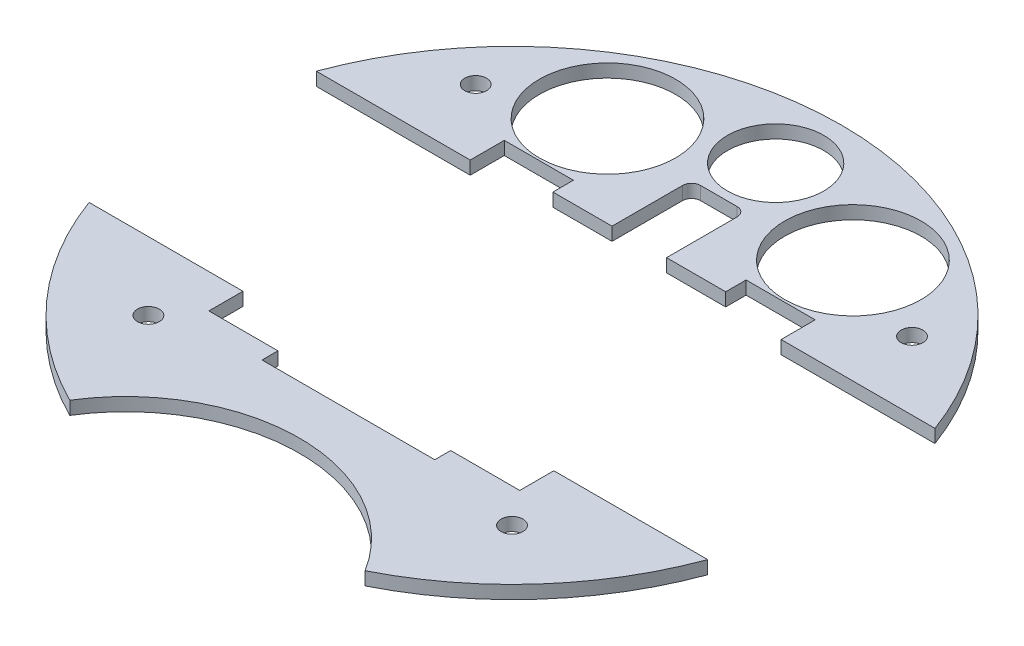
ISO-10303-21;
HEADER;
FILE_DESCRIPTION(('STEP AP214'),'2;1');
FILE_NAME('part.step','',(''),(''),'','','');
FILE_SCHEMA(('AUTOMOTIVE_DESIGN { 1 0 10303 214 1 1 1 1 }'));
ENDSEC;
DATA;
#1=APPLICATION_CONTEXT('core data for automotive mechanical design processes');
#2=APPLICATION_PROTOCOL_DEFINITION('international standard','automotive_design',2000,#1);
#3=PRODUCT_CONTEXT('',#1,'mechanical');
#4=PRODUCT('Part','Part','',(#3));
#5=PRODUCT_RELATED_PRODUCT_CATEGORY('part','',(#4));
#6=PRODUCT_DEFINITION_FORMATION('','',#4);
#7=PRODUCT_DEFINITION_CONTEXT('part definition',#1,'design');
#8=PRODUCT_DEFINITION('design','',#6,#7);
#9=PRODUCT_DEFINITION_SHAPE('','',#8);
#10=(LENGTH_UNIT() NAMED_UNIT(*) SI_UNIT(.MILLI.,.METRE.));
#11=(NAMED_UNIT(*) PLANE_ANGLE_UNIT() SI_UNIT($,.RADIAN.));
#12=(NAMED_UNIT(*) SI_UNIT($,.STERADIAN.) SOLID_ANGLE_UNIT());
#13=UNCERTAINTY_MEASURE_WITH_UNIT(LENGTH_MEASURE(1.E-05),#10,'distance_accuracy_value','');
#14=(GEOMETRIC_REPRESENTATION_CONTEXT(3) GLOBAL_UNCERTAINTY_ASSIGNED_CONTEXT((#13)) GLOBAL_UNIT_ASSIGNED_CONTEXT((#10,
#11,#12)) REPRESENTATION_CONTEXT('',''));
#15=CARTESIAN_POINT('',(0.,0.,0.));
#16=DIRECTION('',(0.,0.,1.));
#17=DIRECTION('',(1.,0.,0.));
#18=AXIS2_PLACEMENT_3D('',#15,#16,#17);
#19=CARTESIAN_POINT('',(0.,2.9,42.5));
#20=DIRECTION('',(0.,1.,0.));
#21=DIRECTION('',(0.,0.,1.));
#22=AXIS2_PLACEMENT_3D('',#19,#20,#21);
#23=PLANE('',#22);
#24=DIRECTION('',(1.,0.,0.));
#25=VECTOR('',#24,1.);
#26=CARTESIAN_POINT('',(34.2,2.9,25.0000000000002));
#27=LINE('',#26,#25);
#28=CARTESIAN_POINT('',(34.2,2.9,25.0000000000002));
#29=VERTEX_POINT('',#28);
#30=CARTESIAN_POINT('',(68.0532879440809,2.9,25.0000000000002));
#31=VERTEX_POINT('',#30);
#32=EDGE_CURVE('E53',#29,#31,#27,.T.);
#33=ORIENTED_EDGE('',*,*,#32,.F.);
#34=DIRECTION('',(0.,0.,-1.));
#35=VECTOR('',#34,1.);
#36=CARTESIAN_POINT('',(34.2,2.9,32.5000000000002));
#37=LINE('',#36,#35);
#38=CARTESIAN_POINT('',(34.2,2.9,32.5000000000002));
#39=VERTEX_POINT('',#38);
#40=EDGE_CURVE('E82',#39,#29,#37,.T.);
#41=ORIENTED_EDGE('',*,*,#40,.F.);
#42=DIRECTION('',(1.,0.,0.));
#43=VECTOR('',#42,1.);
#44=CARTESIAN_POINT('',(34.2,2.9,32.5000000000002));
#45=LINE('',#44,#43);
#46=CARTESIAN_POINT('',(19.,2.9,32.5000000000002));
#47=VERTEX_POINT('',#46);
#48=EDGE_CURVE('E190',#47,#39,#45,.T.);
#49=ORIENTED_EDGE('',*,*,#48,.F.);
#50=DIRECTION('',(0.,0.,-1.));
#51=VECTOR('',#50,1.);
#52=CARTESIAN_POINT('',(19.,2.9,36.));
#53=LINE('',#52,#51);
#54=CARTESIAN_POINT('',(19.,2.9,36.));
#55=VERTEX_POINT('',#54);
#56=EDGE_CURVE('E167',#55,#47,#53,.T.);
#57=ORIENTED_EDGE('',*,*,#56,.F.);
#58=DIRECTION('',(1.,0.,0.));
#59=VECTOR('',#58,1.);
#60=CARTESIAN_POINT('',(-19.,2.9,36.));
#61=LINE('',#60,#59);
#62=CARTESIAN_POINT('',(-19.,2.9,36.));
#63=VERTEX_POINT('',#62);
#64=EDGE_CURVE('E163',#63,#55,#61,.T.);
#65=ORIENTED_EDGE('',*,*,#64,.F.);
#66=DIRECTION('',(0.,0.,1.));
#67=VECTOR('',#66,1.);
#68=CARTESIAN_POINT('',(-19.,2.9,-28.));
#69=LINE('',#68,#67);
#70=CARTESIAN_POINT('',(-19.,2.9,32.5000000000002));
#71=VERTEX_POINT('',#70);
#72=EDGE_CURVE('E154',#71,#63,#69,.T.);
#73=ORIENTED_EDGE('',*,*,#72,.F.);
#74=DIRECTION('',(1.,0.,0.));
#75=VECTOR('',#74,1.);
#76=CARTESIAN_POINT('',(-22.2,2.9,32.5000000000002));
#77=LINE('',#76,#75);
#78=CARTESIAN_POINT('',(-34.2,2.9,32.5000000000002));
#79=VERTEX_POINT('',#78);
#80=EDGE_CURVE('E191',#79,#71,#77,.T.);
#81=ORIENTED_EDGE('',*,*,#80,.F.);
#82=DIRECTION('',(0.,0.,1.));
#83=VECTOR('',#82,1.);
#84=CARTESIAN_POINT('',(-34.2,2.9,32.5000000000002));
#85=LINE('',#84,#83);
#86=CARTESIAN_POINT('',(-34.2,2.9,25.0000000000002));
#87=VERTEX_POINT('',#86);
#88=EDGE_CURVE('E186',#87,#79,#85,.T.);
#89=ORIENTED_EDGE('',*,*,#88,.F.);
#90=DIRECTION('',(1.,0.,0.));
#91=VECTOR('',#90,1.);
#92=CARTESIAN_POINT('',(-34.2,2.9,25.0000000000002));
#93=LINE('',#92,#91);
#94=CARTESIAN_POINT('',(-68.0532879440809,2.9,25.0000000000002));
#95=VERTEX_POINT('',#94);
#96=EDGE_CURVE('E129',#95,#87,#93,.T.);
#97=ORIENTED_EDGE('',*,*,#96,.F.);
#98=CARTESIAN_POINT('',(0.,2.9,0.));
#99=DIRECTION('',(0.,1.,0.));
#100=DIRECTION('',(0.,0.,1.));
#101=AXIS2_PLACEMENT_3D('',#98,#99,#100);
#102=CIRCLE('',#101,72.5);
#103=CARTESIAN_POINT('',(-32.4891087499309,2.9,64.8128676470588));
#104=VERTEX_POINT('',#103);
#105=EDGE_CURVE('E110',#95,#104,#102,.T.);
#106=ORIENTED_EDGE('',*,*,#105,.T.);
#107=CARTESIAN_POINT('',(0.,2.9,85.));
#108=DIRECTION('',(0.,-1.,0.));
#109=DIRECTION('',(0.,0.,1.));
#110=AXIS2_PLACEMENT_3D('',#107,#108,#109);
#111=CIRCLE('',#110,38.25);
#112=CARTESIAN_POINT('',(32.4891087499309,2.9,64.8128676470588));
#113=VERTEX_POINT('',#112);
#114=EDGE_CURVE('E109',#104,#113,#111,.T.);
#115=ORIENTED_EDGE('',*,*,#114,.T.);
#116=EDGE_CURVE('E107',#113,#31,#102,.T.);
#117=ORIENTED_EDGE('',*,*,#116,.T.);
#118=EDGE_LOOP('',(#33,#41,#49,#57,#65,#73,#81,#89,#97,#106,#115,#117));
#119=FACE_BOUND('',#118,.T.);
#120=CARTESIAN_POINT('',(40.,2.9,40.));
#121=DIRECTION('',(0.,1.,0.));
#122=DIRECTION('',(0.,0.,1.));
#123=AXIS2_PLACEMENT_3D('',#120,#121,#122);
#124=CIRCLE('',#123,2.4);
#125=CARTESIAN_POINT('',(40.,2.9,42.4));
#126=VERTEX_POINT('',#125);
#127=EDGE_CURVE('E162',#126,#126,#124,.T.);
#128=ORIENTED_EDGE('',*,*,#127,.F.);
#129=EDGE_LOOP('',(#128));
#130=FACE_BOUND('',#129,.T.);
#131=CARTESIAN_POINT('',(-40.,2.9,40.));
#132=DIRECTION('',(0.,1.,0.));
#133=DIRECTION('',(0.,0.,1.));
#134=AXIS2_PLACEMENT_3D('',#131,#132,#133);
#135=CIRCLE('',#134,2.4);
#136=CARTESIAN_POINT('',(-40.,2.9,42.4));
#137=VERTEX_POINT('',#136);
#138=EDGE_CURVE('E183',#137,#137,#135,.T.);
#139=ORIENTED_EDGE('',*,*,#138,.F.);
#140=EDGE_LOOP('',(#139));
#141=FACE_BOUND('',#140,.T.);
#142=ADVANCED_FACE('F43',(#119,#130,#141),#23,.T.);
#143=CARTESIAN_POINT('',(0.,0.,42.5));
#144=DIRECTION('',(0.,1.,0.));
#145=DIRECTION('',(0.,0.,1.));
#146=AXIS2_PLACEMENT_3D('',#143,#144,#145);
#147=PLANE('',#146);
#148=CARTESIAN_POINT('',(40.,0.,40.));
#149=DIRECTION('',(0.,1.,0.));
#150=DIRECTION('',(0.,0.,1.));
#151=AXIS2_PLACEMENT_3D('',#148,#149,#150);
#152=CIRCLE('',#151,2.4);
#153=CARTESIAN_POINT('',(40.,0.,42.4));
#154=VERTEX_POINT('',#153);
#155=EDGE_CURVE('E101',#154,#154,#152,.T.);
#156=ORIENTED_EDGE('',*,*,#155,.T.);
#157=EDGE_LOOP('',(#156));
#158=FACE_BOUND('',#157,.T.);
#159=CARTESIAN_POINT('',(-40.,0.,40.));
#160=DIRECTION('',(0.,1.,0.));
#161=DIRECTION('',(0.,0.,1.));
#162=AXIS2_PLACEMENT_3D('',#159,#160,#161);
#163=CIRCLE('',#162,2.4);
#164=CARTESIAN_POINT('',(-40.,0.,42.4));
#165=VERTEX_POINT('',#164);
#166=EDGE_CURVE('E98',#165,#165,#163,.T.);
#167=ORIENTED_EDGE('',*,*,#166,.T.);
#168=EDGE_LOOP('',(#167));
#169=FACE_BOUND('',#168,.T.);
#170=DIRECTION('',(0.,0.,-1.));
#171=VECTOR('',#170,1.);
#172=CARTESIAN_POINT('',(34.2,0.,32.5000000000002));
#173=LINE('',#172,#171);
#174=CARTESIAN_POINT('',(34.2,0.,32.5000000000002));
#175=VERTEX_POINT('',#174);
#176=CARTESIAN_POINT('',(34.2,0.,25.0000000000002));
#177=VERTEX_POINT('',#176);
#178=EDGE_CURVE('E79',#175,#177,#173,.T.);
#179=ORIENTED_EDGE('',*,*,#178,.T.);
#180=DIRECTION('',(1.,0.,0.));
#181=VECTOR('',#180,1.);
#182=CARTESIAN_POINT('',(34.2,0.,25.0000000000002));
#183=LINE('',#182,#181);
#184=CARTESIAN_POINT('',(68.0532879440809,0.,25.0000000000002));
#185=VERTEX_POINT('',#184);
#186=EDGE_CURVE('E85',#177,#185,#183,.T.);
#187=ORIENTED_EDGE('',*,*,#186,.T.);
#188=CARTESIAN_POINT('',(0.,0.,0.));
#189=DIRECTION('',(0.,1.,0.));
#190=DIRECTION('',(0.,0.,1.));
#191=AXIS2_PLACEMENT_3D('',#188,#189,#190);
#192=CIRCLE('',#191,72.5);
#193=CARTESIAN_POINT('',(32.4891087499309,0.,64.8128676470588));
#194=VERTEX_POINT('',#193);
#195=EDGE_CURVE('E47',#194,#185,#192,.T.);
#196=ORIENTED_EDGE('',*,*,#195,.F.);
#197=CARTESIAN_POINT('',(0.,0.,85.));
#198=DIRECTION('',(0.,-1.,0.));
#199=DIRECTION('',(0.,0.,1.));
#200=AXIS2_PLACEMENT_3D('',#197,#198,#199);
#201=CIRCLE('',#200,38.25);
#202=CARTESIAN_POINT('',(-32.4891087499309,0.,64.8128676470588));
#203=VERTEX_POINT('',#202);
#204=EDGE_CURVE('E143',#203,#194,#201,.T.);
#205=ORIENTED_EDGE('',*,*,#204,.F.);
#206=CARTESIAN_POINT('',(-68.0532879440809,0.,25.0000000000002));
#207=VERTEX_POINT('',#206);
#208=EDGE_CURVE('E105',#207,#203,#192,.T.);
#209=ORIENTED_EDGE('',*,*,#208,.F.);
#210=DIRECTION('',(1.,0.,0.));
#211=VECTOR('',#210,1.);
#212=CARTESIAN_POINT('',(-34.2,0.,25.0000000000002));
#213=LINE('',#212,#211);
#214=CARTESIAN_POINT('',(-34.2,0.,25.0000000000002));
#215=VERTEX_POINT('',#214);
#216=EDGE_CURVE('E92',#207,#215,#213,.T.);
#217=ORIENTED_EDGE('',*,*,#216,.T.);
#218=DIRECTION('',(0.,0.,1.));
#219=VECTOR('',#218,1.);
#220=CARTESIAN_POINT('',(-34.2,0.,32.5000000000002));
#221=LINE('',#220,#219);
#222=CARTESIAN_POINT('',(-34.2,0.,32.5000000000002));
#223=VERTEX_POINT('',#222);
#224=EDGE_CURVE('E206',#215,#223,#221,.T.);
#225=ORIENTED_EDGE('',*,*,#224,.T.);
#226=DIRECTION('',(1.,0.,0.));
#227=VECTOR('',#226,1.);
#228=CARTESIAN_POINT('',(-34.2,0.,32.5000000000002));
#229=LINE('',#228,#227);
#230=CARTESIAN_POINT('',(-19.,0.,32.5000000000002));
#231=VERTEX_POINT('',#230);
#232=EDGE_CURVE('E181',#223,#231,#229,.T.);
#233=ORIENTED_EDGE('',*,*,#232,.T.);
#234=DIRECTION('',(0.,0.,1.));
#235=VECTOR('',#234,1.);
#236=CARTESIAN_POINT('',(-19.,0.,-28.));
#237=LINE('',#236,#235);
#238=CARTESIAN_POINT('',(-19.,0.,36.));
#239=VERTEX_POINT('',#238);
#240=EDGE_CURVE('E178',#231,#239,#237,.T.);
#241=ORIENTED_EDGE('',*,*,#240,.T.);
#242=DIRECTION('',(1.,0.,0.));
#243=VECTOR('',#242,1.);
#244=CARTESIAN_POINT('',(-19.,0.,36.));
#245=LINE('',#244,#243);
#246=CARTESIAN_POINT('',(19.,0.,36.));
#247=VERTEX_POINT('',#246);
#248=EDGE_CURVE('E175',#239,#247,#245,.T.);
#249=ORIENTED_EDGE('',*,*,#248,.T.);
#250=DIRECTION('',(0.,0.,-1.));
#251=VECTOR('',#250,1.);
#252=CARTESIAN_POINT('',(19.,0.,36.));
#253=LINE('',#252,#251);
#254=CARTESIAN_POINT('',(19.,0.,32.5000000000002));
#255=VERTEX_POINT('',#254);
#256=EDGE_CURVE('E106',#247,#255,#253,.T.);
#257=ORIENTED_EDGE('',*,*,#256,.T.);
#258=DIRECTION('',(1.,0.,0.));
#259=VECTOR('',#258,1.);
#260=CARTESIAN_POINT('',(22.2,0.,32.5000000000002));
#261=LINE('',#260,#259);
#262=EDGE_CURVE('E97',#255,#175,#261,.T.);
#263=ORIENTED_EDGE('',*,*,#262,.T.);
#264=EDGE_LOOP('',(#179,#187,#196,#205,#209,#217,#225,#233,#241,#249,#257,#263));
#265=FACE_BOUND('',#264,.T.);
#266=ADVANCED_FACE('F94',(#158,#169,#265),#147,.F.);
#267=CARTESIAN_POINT('',(0.,2.9,0.));
#268=DIRECTION('',(0.,-1.,0.));
#269=DIRECTION('',(0.,0.,-1.));
#270=AXIS2_PLACEMENT_3D('',#267,#268,#269);
#271=CYLINDRICAL_SURFACE('',#270,72.5);
#272=ORIENTED_EDGE('',*,*,#105,.F.);
#273=DIRECTION('',(0.,1.,0.));
#274=VECTOR('',#273,1.);
#275=CARTESIAN_POINT('',(-68.0532879440809,0.,25.0000000000002));
#276=LINE('',#275,#274);
#277=EDGE_CURVE('E193',#207,#95,#276,.T.);
#278=ORIENTED_EDGE('',*,*,#277,.F.);
#279=ORIENTED_EDGE('',*,*,#208,.T.);
#280=DIRECTION('',(0.,-1.,0.));
#281=VECTOR('',#280,1.);
#282=CARTESIAN_POINT('',(-32.4891087499309,2.9,64.8128676470588));
#283=LINE('',#282,#281);
#284=EDGE_CURVE('E136',#104,#203,#283,.T.);
#285=ORIENTED_EDGE('',*,*,#284,.F.);
#286=EDGE_LOOP('',(#272,#278,#279,#285));
#287=FACE_BOUND('',#286,.T.);
#288=ADVANCED_FACE('F137',(#287),#271,.T.);
#289=CARTESIAN_POINT('',(0.,2.9,85.));
#290=DIRECTION('',(0.,-1.,0.));
#291=DIRECTION('',(0.,0.,-1.));
#292=AXIS2_PLACEMENT_3D('',#289,#290,#291);
#293=CYLINDRICAL_SURFACE('',#292,38.25);
#294=ORIENTED_EDGE('',*,*,#204,.T.);
#295=DIRECTION('',(0.,-1.,0.));
#296=VECTOR('',#295,1.);
#297=CARTESIAN_POINT('',(32.4891087499309,2.9,64.8128676470588));
#298=LINE('',#297,#296);
#299=EDGE_CURVE('E147',#113,#194,#298,.T.);
#300=ORIENTED_EDGE('',*,*,#299,.F.);
#301=ORIENTED_EDGE('',*,*,#114,.F.);
#302=ORIENTED_EDGE('',*,*,#284,.T.);
#303=EDGE_LOOP('',(#294,#300,#301,#302));
#304=FACE_BOUND('',#303,.T.);
#305=ADVANCED_FACE('F145',(#304),#293,.F.);
#306=ORIENTED_EDGE('',*,*,#195,.T.);
#307=DIRECTION('',(0.,1.,0.));
#308=VECTOR('',#307,1.);
#309=CARTESIAN_POINT('',(68.0532879440809,0.,25.0000000000002));
#310=LINE('',#309,#308);
#311=EDGE_CURVE('E88',#185,#31,#310,.T.);
#312=ORIENTED_EDGE('',*,*,#311,.T.);
#313=ORIENTED_EDGE('',*,*,#116,.F.);
#314=ORIENTED_EDGE('',*,*,#299,.T.);
#315=EDGE_LOOP('',(#306,#312,#313,#314));
#316=FACE_BOUND('',#315,.T.);
#317=ADVANCED_FACE('F45',(#316),#271,.T.);
#318=CARTESIAN_POINT('',(-19.,0.,-28.));
#319=DIRECTION('',(-1.,0.,0.));
#320=DIRECTION('',(0.,0.,1.));
#321=AXIS2_PLACEMENT_3D('',#318,#319,#320);
#322=PLANE('',#321);
#323=ORIENTED_EDGE('',*,*,#240,.F.);
#324=DIRECTION('',(0.,1.,0.));
#325=VECTOR('',#324,1.);
#326=CARTESIAN_POINT('',(-19.,0.,32.5000000000002));
#327=LINE('',#326,#325);
#328=EDGE_CURVE('E151',#231,#71,#327,.T.);
#329=ORIENTED_EDGE('',*,*,#328,.T.);
#330=ORIENTED_EDGE('',*,*,#72,.T.);
#331=DIRECTION('',(0.,1.,0.));
#332=VECTOR('',#331,1.);
#333=CARTESIAN_POINT('',(-19.,0.,36.));
#334=LINE('',#333,#332);
#335=EDGE_CURVE('E159',#239,#63,#334,.T.);
#336=ORIENTED_EDGE('',*,*,#335,.F.);
#337=EDGE_LOOP('',(#323,#329,#330,#336));
#338=FACE_BOUND('',#337,.T.);
#339=ADVANCED_FACE('F262',(#338),#322,.F.);
#340=CARTESIAN_POINT('',(19.,0.,36.));
#341=DIRECTION('',(1.,0.,0.));
#342=DIRECTION('',(0.,0.,-1.));
#343=AXIS2_PLACEMENT_3D('',#340,#341,#342);
#344=PLANE('',#343);
#345=ORIENTED_EDGE('',*,*,#56,.T.);
#346=DIRECTION('',(0.,1.,0.));
#347=VECTOR('',#346,1.);
#348=CARTESIAN_POINT('',(19.,0.,32.5000000000002));
#349=LINE('',#348,#347);
#350=EDGE_CURVE('E211',#255,#47,#349,.T.);
#351=ORIENTED_EDGE('',*,*,#350,.F.);
#352=ORIENTED_EDGE('',*,*,#256,.F.);
#353=DIRECTION('',(0.,1.,0.));
#354=VECTOR('',#353,1.);
#355=CARTESIAN_POINT('',(19.,0.,36.));
#356=LINE('',#355,#354);
#357=EDGE_CURVE('E164',#247,#55,#356,.T.);
#358=ORIENTED_EDGE('',*,*,#357,.T.);
#359=EDGE_LOOP('',(#345,#351,#352,#358));
#360=FACE_BOUND('',#359,.T.);
#361=ADVANCED_FACE('F270',(#360),#344,.F.);
#362=CARTESIAN_POINT('',(-19.,0.,36.));
#363=DIRECTION('',(0.,0.,1.));
#364=DIRECTION('',(1.,0.,0.));
#365=AXIS2_PLACEMENT_3D('',#362,#363,#364);
#366=PLANE('',#365);
#367=ORIENTED_EDGE('',*,*,#64,.T.);
#368=ORIENTED_EDGE('',*,*,#357,.F.);
#369=ORIENTED_EDGE('',*,*,#248,.F.);
#370=ORIENTED_EDGE('',*,*,#335,.T.);
#371=EDGE_LOOP('',(#367,#368,#369,#370));
#372=FACE_BOUND('',#371,.T.);
#373=ADVANCED_FACE('F268',(#372),#366,.F.);
#374=CARTESIAN_POINT('',(40.,0.,40.));
#375=DIRECTION('',(0.,1.,0.));
#376=DIRECTION('',(0.,0.,1.));
#377=AXIS2_PLACEMENT_3D('',#374,#375,#376);
#378=CYLINDRICAL_SURFACE('',#377,2.4);
#379=ORIENTED_EDGE('',*,*,#155,.F.);
#380=EDGE_LOOP('',(#379));
#381=FACE_BOUND('',#380,.T.);
#382=ORIENTED_EDGE('',*,*,#127,.T.);
#383=EDGE_LOOP('',(#382));
#384=FACE_BOUND('',#383,.T.);
#385=ADVANCED_FACE('F279',(#381,#384),#378,.F.);
#386=CARTESIAN_POINT('',(-40.,0.,40.));
#387=DIRECTION('',(0.,1.,0.));
#388=DIRECTION('',(0.,0.,1.));
#389=AXIS2_PLACEMENT_3D('',#386,#387,#388);
#390=CYLINDRICAL_SURFACE('',#389,2.4);
#391=ORIENTED_EDGE('',*,*,#166,.F.);
#392=EDGE_LOOP('',(#391));
#393=FACE_BOUND('',#392,.T.);
#394=ORIENTED_EDGE('',*,*,#138,.T.);
#395=EDGE_LOOP('',(#394));
#396=FACE_BOUND('',#395,.T.);
#397=ADVANCED_FACE('F302',(#393,#396),#390,.F.);
#398=CARTESIAN_POINT('',(-34.2,0.,32.5000000000002));
#399=DIRECTION('',(-1.,0.,0.));
#400=DIRECTION('',(0.,0.,1.));
#401=AXIS2_PLACEMENT_3D('',#398,#399,#400);
#402=PLANE('',#401);
#403=ORIENTED_EDGE('',*,*,#88,.T.);
#404=DIRECTION('',(0.,1.,0.));
#405=VECTOR('',#404,1.);
#406=CARTESIAN_POINT('',(-34.2,0.,32.5000000000002));
#407=LINE('',#406,#405);
#408=EDGE_CURVE('E188',#223,#79,#407,.T.);
#409=ORIENTED_EDGE('',*,*,#408,.F.);
#410=ORIENTED_EDGE('',*,*,#224,.F.);
#411=DIRECTION('',(0.,1.,0.));
#412=VECTOR('',#411,1.);
#413=CARTESIAN_POINT('',(-34.2,0.,25.0000000000002));
#414=LINE('',#413,#412);
#415=EDGE_CURVE('E196',#215,#87,#414,.T.);
#416=ORIENTED_EDGE('',*,*,#415,.T.);
#417=EDGE_LOOP('',(#403,#409,#410,#416));
#418=FACE_BOUND('',#417,.T.);
#419=ADVANCED_FACE('F251',(#418),#402,.F.);
#420=CARTESIAN_POINT('',(-34.2,0.,25.0000000000002));
#421=DIRECTION('',(0.,0.,1.));
#422=DIRECTION('',(1.,0.,0.));
#423=AXIS2_PLACEMENT_3D('',#420,#421,#422);
#424=PLANE('',#423);
#425=ORIENTED_EDGE('',*,*,#96,.T.);
#426=ORIENTED_EDGE('',*,*,#415,.F.);
#427=ORIENTED_EDGE('',*,*,#216,.F.);
#428=ORIENTED_EDGE('',*,*,#277,.T.);
#429=EDGE_LOOP('',(#425,#426,#427,#428));
#430=FACE_BOUND('',#429,.T.);
#431=ADVANCED_FACE('F257',(#430),#424,.F.);
#432=CARTESIAN_POINT('',(-22.2,0.,32.5000000000002));
#433=DIRECTION('',(0.,0.,1.));
#434=DIRECTION('',(1.,0.,0.));
#435=AXIS2_PLACEMENT_3D('',#432,#433,#434);
#436=PLANE('',#435);
#437=ORIENTED_EDGE('',*,*,#80,.T.);
#438=ORIENTED_EDGE('',*,*,#328,.F.);
#439=ORIENTED_EDGE('',*,*,#232,.F.);
#440=ORIENTED_EDGE('',*,*,#408,.T.);
#441=EDGE_LOOP('',(#437,#438,#439,#440));
#442=FACE_BOUND('',#441,.T.);
#443=ADVANCED_FACE('F254',(#442),#436,.F.);
#444=CARTESIAN_POINT('',(34.2,0.,32.5000000000002));
#445=DIRECTION('',(0.,0.,1.));
#446=DIRECTION('',(1.,0.,0.));
#447=AXIS2_PLACEMENT_3D('',#444,#445,#446);
#448=PLANE('',#447);
#449=ORIENTED_EDGE('',*,*,#48,.T.);
#450=DIRECTION('',(0.,1.,0.));
#451=VECTOR('',#450,1.);
#452=CARTESIAN_POINT('',(34.2,0.,32.5000000000002));
#453=LINE('',#452,#451);
#454=EDGE_CURVE('E213',#175,#39,#453,.T.);
#455=ORIENTED_EDGE('',*,*,#454,.F.);
#456=ORIENTED_EDGE('',*,*,#262,.F.);
#457=ORIENTED_EDGE('',*,*,#350,.T.);
#458=EDGE_LOOP('',(#449,#455,#456,#457));
#459=FACE_BOUND('',#458,.T.);
#460=ADVANCED_FACE('F220',(#459),#448,.F.);
#461=CARTESIAN_POINT('',(34.2,0.,32.5000000000002));
#462=DIRECTION('',(1.,0.,0.));
#463=DIRECTION('',(0.,0.,-1.));
#464=AXIS2_PLACEMENT_3D('',#461,#462,#463);
#465=PLANE('',#464);
#466=ORIENTED_EDGE('',*,*,#40,.T.);
#467=DIRECTION('',(0.,1.,0.));
#468=VECTOR('',#467,1.);
#469=CARTESIAN_POINT('',(34.2,0.,25.0000000000002));
#470=LINE('',#469,#468);
#471=EDGE_CURVE('E12',#177,#29,#470,.T.);
#472=ORIENTED_EDGE('',*,*,#471,.F.);
#473=ORIENTED_EDGE('',*,*,#178,.F.);
#474=ORIENTED_EDGE('',*,*,#454,.T.);
#475=EDGE_LOOP('',(#466,#472,#473,#474));
#476=FACE_BOUND('',#475,.T.);
#477=ADVANCED_FACE('F77',(#476),#465,.F.);
#478=CARTESIAN_POINT('',(34.2,0.,25.0000000000002));
#479=DIRECTION('',(0.,0.,1.));
#480=DIRECTION('',(1.,0.,0.));
#481=AXIS2_PLACEMENT_3D('',#478,#479,#480);
#482=PLANE('',#481);
#483=ORIENTED_EDGE('',*,*,#32,.T.);
#484=ORIENTED_EDGE('',*,*,#311,.F.);
#485=ORIENTED_EDGE('',*,*,#186,.F.);
#486=ORIENTED_EDGE('',*,*,#471,.T.);
#487=EDGE_LOOP('',(#483,#484,#485,#486));
#488=FACE_BOUND('',#487,.T.);
#489=ADVANCED_FACE('F86',(#488),#482,.F.);
#490=CLOSED_SHELL('',(#142,#266,#288,#305,#317,#339,#361,#373,#385,#397,#419,#431,#443,#460,
#477,#489));
#491=MANIFOLD_SOLID_BREP('B2',#490);
#492=CARTESIAN_POINT('',(19.,0.,-28.));
#493=DIRECTION('',(0.,0.,-1.));
#494=DIRECTION('',(-1.,0.,0.));
#495=AXIS2_PLACEMENT_3D('',#492,#493,#494);
#496=PLANE('',#495);
#497=DIRECTION('',(-1.,0.,0.));
#498=VECTOR('',#497,1.);
#499=CARTESIAN_POINT('',(19.,0.,-28.));
#500=LINE('',#499,#498);
#501=CARTESIAN_POINT('',(-6.,0.,-28.));
#502=VERTEX_POINT('',#501);
#503=CARTESIAN_POINT('',(-19.,0.,-28.));
#504=VERTEX_POINT('',#503);
#505=EDGE_CURVE('E444',#502,#504,#500,.T.);
#506=ORIENTED_EDGE('',*,*,#505,.F.);
#507=DIRECTION('',(0.,1.,0.));
#508=VECTOR('',#507,1.);
#509=CARTESIAN_POINT('',(-6.,0.,-28.));
#510=LINE('',#509,#508);
#511=CARTESIAN_POINT('',(-6.,2.9,-28.));
#512=VERTEX_POINT('',#511);
#513=EDGE_CURVE('E883',#502,#512,#510,.T.);
#514=ORIENTED_EDGE('',*,*,#513,.T.);
#515=DIRECTION('',(-1.,0.,0.));
#516=VECTOR('',#515,1.);
#517=CARTESIAN_POINT('',(19.,2.9,-28.));
#518=LINE('',#517,#516);
#519=CARTESIAN_POINT('',(-19.,2.9,-28.));
#520=VERTEX_POINT('',#519);
#521=EDGE_CURVE('E568',#512,#520,#518,.T.);
#522=ORIENTED_EDGE('',*,*,#521,.T.);
#523=DIRECTION('',(0.,1.,0.));
#524=VECTOR('',#523,1.);
#525=CARTESIAN_POINT('',(-19.,0.,-28.));
#526=LINE('',#525,#524);
#527=EDGE_CURVE('E561',#504,#520,#526,.T.);
#528=ORIENTED_EDGE('',*,*,#527,.F.);
#529=EDGE_LOOP('',(#506,#514,#522,#528));
#530=FACE_BOUND('',#529,.T.);
#531=ADVANCED_FACE('F420',(#530),#496,.F.);
#532=CARTESIAN_POINT('',(27.,0.,-48.));
#533=DIRECTION('',(0.,1.,0.));
#534=DIRECTION('',(0.,0.,1.));
#535=AXIS2_PLACEMENT_3D('',#532,#533,#534);
#536=CYLINDRICAL_SURFACE('',#535,15.);
#537=CARTESIAN_POINT('',(27.,0.,-48.));
#538=DIRECTION('',(0.,1.,0.));
#539=DIRECTION('',(0.,0.,1.));
#540=AXIS2_PLACEMENT_3D('',#537,#538,#539);
#541=CIRCLE('',#540,15.);
#542=CARTESIAN_POINT('',(27.,0.,-33.));
#543=VERTEX_POINT('',#542);
#544=EDGE_CURVE('E635',#543,#543,#541,.T.);
#545=ORIENTED_EDGE('',*,*,#544,.F.);
#546=EDGE_LOOP('',(#545));
#547=FACE_BOUND('',#546,.T.);
#548=CARTESIAN_POINT('',(27.,2.9,-48.));
#549=DIRECTION('',(0.,1.,0.));
#550=DIRECTION('',(0.,0.,1.));
#551=AXIS2_PLACEMENT_3D('',#548,#549,#550);
#552=CIRCLE('',#551,15.);
#553=CARTESIAN_POINT('',(27.,2.9,-33.));
#554=VERTEX_POINT('',#553);
#555=EDGE_CURVE('E565',#554,#554,#552,.T.);
#556=ORIENTED_EDGE('',*,*,#555,.T.);
#557=EDGE_LOOP('',(#556));
#558=FACE_BOUND('',#557,.T.);
#559=ADVANCED_FACE('F642',(#547,#558),#536,.F.);
#560=CARTESIAN_POINT('',(-27.,0.,-48.));
#561=DIRECTION('',(0.,1.,0.));
#562=DIRECTION('',(0.,0.,1.));
#563=AXIS2_PLACEMENT_3D('',#560,#561,#562);
#564=CYLINDRICAL_SURFACE('',#563,15.);
#565=CARTESIAN_POINT('',(-27.,0.,-48.));
#566=DIRECTION('',(0.,1.,0.));
#567=DIRECTION('',(0.,0.,1.));
#568=AXIS2_PLACEMENT_3D('',#565,#566,#567);
#569=CIRCLE('',#568,15.);
#570=CARTESIAN_POINT('',(-27.,0.,-33.));
#571=VERTEX_POINT('',#570);
#572=EDGE_CURVE('E631',#571,#571,#569,.T.);
#573=ORIENTED_EDGE('',*,*,#572,.F.);
#574=EDGE_LOOP('',(#573));
#575=FACE_BOUND('',#574,.T.);
#576=CARTESIAN_POINT('',(-27.,2.9,-48.));
#577=DIRECTION('',(0.,1.,0.));
#578=DIRECTION('',(0.,0.,1.));
#579=AXIS2_PLACEMENT_3D('',#576,#577,#578);
#580=CIRCLE('',#579,15.);
#581=CARTESIAN_POINT('',(-27.,2.9,-33.));
#582=VERTEX_POINT('',#581);
#583=EDGE_CURVE('E622',#582,#582,#580,.T.);
#584=ORIENTED_EDGE('',*,*,#583,.T.);
#585=EDGE_LOOP('',(#584));
#586=FACE_BOUND('',#585,.T.);
#587=ADVANCED_FACE('F662',(#575,#586),#564,.F.);
#588=CARTESIAN_POINT('',(-48.,0.,-40.));
#589=DIRECTION('',(0.,1.,0.));
#590=DIRECTION('',(0.,0.,1.));
#591=AXIS2_PLACEMENT_3D('',#588,#589,#590);
#592=CYLINDRICAL_SURFACE('',#591,2.4);
#593=CARTESIAN_POINT('',(-48.,0.,-40.));
#594=DIRECTION('',(0.,1.,0.));
#595=DIRECTION('',(0.,0.,1.));
#596=AXIS2_PLACEMENT_3D('',#593,#594,#595);
#597=CIRCLE('',#596,2.4);
#598=CARTESIAN_POINT('',(-48.,0.,-37.6));
#599=VERTEX_POINT('',#598);
#600=EDGE_CURVE('E626',#599,#599,#597,.T.);
#601=ORIENTED_EDGE('',*,*,#600,.F.);
#602=EDGE_LOOP('',(#601));
#603=FACE_BOUND('',#602,.T.);
#604=CARTESIAN_POINT('',(-48.,2.9,-40.));
#605=DIRECTION('',(0.,1.,0.));
#606=DIRECTION('',(0.,0.,1.));
#607=AXIS2_PLACEMENT_3D('',#604,#605,#606);
#608=CIRCLE('',#607,2.4);
#609=CARTESIAN_POINT('',(-48.,2.9,-37.6));
#610=VERTEX_POINT('',#609);
#611=EDGE_CURVE('E591',#610,#610,#608,.T.);
#612=ORIENTED_EDGE('',*,*,#611,.T.);
#613=EDGE_LOOP('',(#612));
#614=FACE_BOUND('',#613,.T.);
#615=ADVANCED_FACE('F683',(#603,#614),#592,.F.);
#616=CARTESIAN_POINT('',(48.,0.,-40.));
#617=DIRECTION('',(0.,1.,0.));
#618=DIRECTION('',(0.,0.,1.));
#619=AXIS2_PLACEMENT_3D('',#616,#617,#618);
#620=CYLINDRICAL_SURFACE('',#619,2.4);
#621=CARTESIAN_POINT('',(48.,0.,-40.));
#622=DIRECTION('',(0.,1.,0.));
#623=DIRECTION('',(0.,0.,1.));
#624=AXIS2_PLACEMENT_3D('',#621,#622,#623);
#625=CIRCLE('',#624,2.4);
#626=CARTESIAN_POINT('',(48.,0.,-37.6));
#627=VERTEX_POINT('',#626);
#628=EDGE_CURVE('E619',#627,#627,#625,.T.);
#629=ORIENTED_EDGE('',*,*,#628,.F.);
#630=EDGE_LOOP('',(#629));
#631=FACE_BOUND('',#630,.T.);
#632=CARTESIAN_POINT('',(48.,2.9,-40.));
#633=DIRECTION('',(0.,1.,0.));
#634=DIRECTION('',(0.,0.,1.));
#635=AXIS2_PLACEMENT_3D('',#632,#633,#634);
#636=CIRCLE('',#635,2.4);
#637=CARTESIAN_POINT('',(48.,2.9,-37.6));
#638=VERTEX_POINT('',#637);
#639=EDGE_CURVE('E623',#638,#638,#636,.T.);
#640=ORIENTED_EDGE('',*,*,#639,.T.);
#641=EDGE_LOOP('',(#640));
#642=FACE_BOUND('',#641,.T.);
#643=ADVANCED_FACE('F680',(#631,#642),#620,.F.);
#644=CARTESIAN_POINT('',(-34.2,0.,-24.9999999999998));
#645=DIRECTION('',(0.,0.,-1.));
#646=DIRECTION('',(-1.,0.,0.));
#647=AXIS2_PLACEMENT_3D('',#644,#645,#646);
#648=PLANE('',#647);
#649=DIRECTION('',(-1.,0.,0.));
#650=VECTOR('',#649,1.);
#651=CARTESIAN_POINT('',(-34.2,2.9,-24.9999999999998));
#652=LINE('',#651,#650);
#653=CARTESIAN_POINT('',(-34.2,2.9,-24.9999999999998));
#654=VERTEX_POINT('',#653);
#655=CARTESIAN_POINT('',(-68.053287944081,2.9,-24.9999999999998));
#656=VERTEX_POINT('',#655);
#657=EDGE_CURVE('E590',#654,#656,#652,.T.);
#658=ORIENTED_EDGE('',*,*,#657,.T.);
#659=DIRECTION('',(0.,1.,0.));
#660=VECTOR('',#659,1.);
#661=CARTESIAN_POINT('',(-68.053287944081,0.,-24.9999999999998));
#662=LINE('',#661,#660);
#663=CARTESIAN_POINT('',(-68.053287944081,0.,-24.9999999999998));
#664=VERTEX_POINT('',#663);
#665=EDGE_CURVE('E579',#664,#656,#662,.T.);
#666=ORIENTED_EDGE('',*,*,#665,.F.);
#667=DIRECTION('',(-1.,0.,0.));
#668=VECTOR('',#667,1.);
#669=CARTESIAN_POINT('',(-34.2,0.,-24.9999999999998));
#670=LINE('',#669,#668);
#671=CARTESIAN_POINT('',(-34.2,0.,-24.9999999999998));
#672=VERTEX_POINT('',#671);
#673=EDGE_CURVE('E587',#672,#664,#670,.T.);
#674=ORIENTED_EDGE('',*,*,#673,.F.);
#675=DIRECTION('',(0.,1.,0.));
#676=VECTOR('',#675,1.);
#677=CARTESIAN_POINT('',(-34.2,0.,-24.9999999999998));
#678=LINE('',#677,#676);
#679=EDGE_CURVE('E592',#672,#654,#678,.T.);
#680=ORIENTED_EDGE('',*,*,#679,.T.);
#681=EDGE_LOOP('',(#658,#666,#674,#680));
#682=FACE_BOUND('',#681,.T.);
#683=ADVANCED_FACE('F586',(#682),#648,.F.);
#684=CARTESIAN_POINT('',(-34.2,0.,-24.9999999999998));
#685=DIRECTION('',(-1.,0.,0.));
#686=DIRECTION('',(0.,0.,1.));
#687=AXIS2_PLACEMENT_3D('',#684,#685,#686);
#688=PLANE('',#687);
#689=DIRECTION('',(0.,0.,1.));
#690=VECTOR('',#689,1.);
#691=CARTESIAN_POINT('',(-34.2,2.9,-24.9999999999998));
#692=LINE('',#691,#690);
#693=CARTESIAN_POINT('',(-34.2,2.9,-32.4999999999999));
#694=VERTEX_POINT('',#693);
#695=EDGE_CURVE('E612',#694,#654,#692,.T.);
#696=ORIENTED_EDGE('',*,*,#695,.T.);
#697=ORIENTED_EDGE('',*,*,#679,.F.);
#698=DIRECTION('',(0.,0.,1.));
#699=VECTOR('',#698,1.);
#700=CARTESIAN_POINT('',(-34.2,0.,-24.9999999999998));
#701=LINE('',#700,#699);
#702=CARTESIAN_POINT('',(-34.2,0.,-32.4999999999999));
#703=VERTEX_POINT('',#702);
#704=EDGE_CURVE('E596',#703,#672,#701,.T.);
#705=ORIENTED_EDGE('',*,*,#704,.F.);
#706=DIRECTION('',(0.,1.,0.));
#707=VECTOR('',#706,1.);
#708=CARTESIAN_POINT('',(-34.2,0.,-32.4999999999999));
#709=LINE('',#708,#707);
#710=EDGE_CURVE('E600',#703,#694,#709,.T.);
#711=ORIENTED_EDGE('',*,*,#710,.T.);
#712=EDGE_LOOP('',(#696,#697,#705,#711));
#713=FACE_BOUND('',#712,.T.);
#714=ADVANCED_FACE('F675',(#713),#688,.F.);
#715=CARTESIAN_POINT('',(-34.2,0.,-32.4999999999999));
#716=DIRECTION('',(0.,0.,-1.));
#717=DIRECTION('',(-1.,0.,0.));
#718=AXIS2_PLACEMENT_3D('',#715,#716,#717);
#719=PLANE('',#718);
#720=DIRECTION('',(-1.,0.,0.));
#721=VECTOR('',#720,1.);
#722=CARTESIAN_POINT('',(-34.2,2.9,-32.4999999999999));
#723=LINE('',#722,#721);
#724=CARTESIAN_POINT('',(-19.,2.9,-32.4999999999999));
#725=VERTEX_POINT('',#724);
#726=EDGE_CURVE('E608',#725,#694,#723,.T.);
#727=ORIENTED_EDGE('',*,*,#726,.T.);
#728=ORIENTED_EDGE('',*,*,#710,.F.);
#729=DIRECTION('',(-1.,0.,0.));
#730=VECTOR('',#729,1.);
#731=CARTESIAN_POINT('',(-22.2,0.,-32.4999999999999));
#732=LINE('',#731,#730);
#733=CARTESIAN_POINT('',(-19.,0.,-32.4999999999999));
#734=VERTEX_POINT('',#733);
#735=EDGE_CURVE('E602',#734,#703,#732,.T.);
#736=ORIENTED_EDGE('',*,*,#735,.F.);
#737=DIRECTION('',(0.,1.,0.));
#738=VECTOR('',#737,1.);
#739=CARTESIAN_POINT('',(-19.,0.,-32.4999999999999));
#740=LINE('',#739,#738);
#741=EDGE_CURVE('E597',#734,#725,#740,.T.);
#742=ORIENTED_EDGE('',*,*,#741,.T.);
#743=EDGE_LOOP('',(#727,#728,#736,#742));
#744=FACE_BOUND('',#743,.T.);
#745=ADVANCED_FACE('F670',(#744),#719,.F.);
#746=CARTESIAN_POINT('',(-19.,0.,-32.4999999999999));
#747=DIRECTION('',(1.,0.,0.));
#748=DIRECTION('',(0.,0.,-1.));
#749=AXIS2_PLACEMENT_3D('',#746,#747,#748);
#750=PLANE('',#749);
#751=DIRECTION('',(0.,0.,-1.));
#752=VECTOR('',#751,1.);
#753=CARTESIAN_POINT('',(-19.,2.9,-32.4999999999999));
#754=LINE('',#753,#752);
#755=EDGE_CURVE('E606',#520,#725,#754,.T.);
#756=ORIENTED_EDGE('',*,*,#755,.T.);
#757=ORIENTED_EDGE('',*,*,#741,.F.);
#758=DIRECTION('',(0.,0.,-1.));
#759=VECTOR('',#758,1.);
#760=CARTESIAN_POINT('',(-19.,0.,-32.4999999999999));
#761=LINE('',#760,#759);
#762=EDGE_CURVE('E615',#504,#734,#761,.T.);
#763=ORIENTED_EDGE('',*,*,#762,.F.);
#764=ORIENTED_EDGE('',*,*,#527,.T.);
#765=EDGE_LOOP('',(#756,#757,#763,#764));
#766=FACE_BOUND('',#765,.T.);
#767=ADVANCED_FACE('F666',(#766),#750,.F.);
#768=CARTESIAN_POINT('',(19.,2.9,-28.));
#769=VERTEX_POINT('',#768);
#770=CARTESIAN_POINT('',(6.,2.9,-28.));
#771=VERTEX_POINT('',#770);
#772=EDGE_CURVE('E549',#769,#771,#518,.T.);
#773=ORIENTED_EDGE('',*,*,#772,.T.);
#774=DIRECTION('',(0.,1.,0.));
#775=VECTOR('',#774,1.);
#776=CARTESIAN_POINT('',(6.,0.,-28.));
#777=LINE('',#776,#775);
#778=CARTESIAN_POINT('',(6.,0.,-28.));
#779=VERTEX_POINT('',#778);
#780=EDGE_CURVE('E435',#779,#771,#777,.T.);
#781=ORIENTED_EDGE('',*,*,#780,.F.);
#782=CARTESIAN_POINT('',(19.,0.,-28.));
#783=VERTEX_POINT('',#782);
#784=EDGE_CURVE('E547',#783,#779,#500,.T.);
#785=ORIENTED_EDGE('',*,*,#784,.F.);
#786=DIRECTION('',(0.,1.,0.));
#787=VECTOR('',#786,1.);
#788=CARTESIAN_POINT('',(19.,0.,-28.));
#789=LINE('',#788,#787);
#790=EDGE_CURVE('E559',#783,#769,#789,.T.);
#791=ORIENTED_EDGE('',*,*,#790,.T.);
#792=EDGE_LOOP('',(#773,#781,#785,#791));
#793=FACE_BOUND('',#792,.T.);
#794=ADVANCED_FACE('F545',(#793),#496,.F.);
#795=CARTESIAN_POINT('',(0.,0.,42.5));
#796=DIRECTION('',(0.,1.,0.));
#797=DIRECTION('',(0.,0.,1.));
#798=AXIS2_PLACEMENT_3D('',#795,#796,#797);
#799=PLANE('',#798);
#800=CARTESIAN_POINT('',(0.,0.,-58.));
#801=DIRECTION('',(0.,1.,0.));
#802=DIRECTION('',(0.,0.,1.));
#803=AXIS2_PLACEMENT_3D('',#800,#801,#802);
#804=CIRCLE('',#803,10.605);
#805=CARTESIAN_POINT('',(0.,0.,-47.395));
#806=VERTEX_POINT('',#805);
#807=EDGE_CURVE('E858',#806,#806,#804,.T.);
#808=ORIENTED_EDGE('',*,*,#807,.T.);
#809=EDGE_LOOP('',(#808));
#810=FACE_BOUND('',#809,.T.);
#811=CARTESIAN_POINT('',(-4.,0.,-43.5));
#812=DIRECTION('',(0.,1.,0.));
#813=DIRECTION('',(0.,0.,-1.));
#814=AXIS2_PLACEMENT_3D('',#811,#812,#813);
#815=CIRCLE('',#814,2.);
#816=CARTESIAN_POINT('',(-4.,0.,-45.5));
#817=VERTEX_POINT('',#816);
#818=CARTESIAN_POINT('',(-6.,0.,-43.5));
#819=VERTEX_POINT('',#818);
#820=EDGE_CURVE('E869',#817,#819,#815,.T.);
#821=ORIENTED_EDGE('',*,*,#820,.T.);
#822=DIRECTION('',(0.,0.,1.));
#823=VECTOR('',#822,1.);
#824=CARTESIAN_POINT('',(-6.,0.,-43.5));
#825=LINE('',#824,#823);
#826=EDGE_CURVE('E550',#819,#502,#825,.T.);
#827=ORIENTED_EDGE('',*,*,#826,.T.);
#828=ORIENTED_EDGE('',*,*,#505,.T.);
#829=ORIENTED_EDGE('',*,*,#762,.T.);
#830=ORIENTED_EDGE('',*,*,#735,.T.);
#831=ORIENTED_EDGE('',*,*,#704,.T.);
#832=ORIENTED_EDGE('',*,*,#673,.T.);
#833=CARTESIAN_POINT('',(0.,0.,0.));
#834=DIRECTION('',(0.,1.,0.));
#835=DIRECTION('',(0.,0.,1.));
#836=AXIS2_PLACEMENT_3D('',#833,#834,#835);
#837=CIRCLE('',#836,72.5);
#838=CARTESIAN_POINT('',(68.053287944081,0.,-24.9999999999998));
#839=VERTEX_POINT('',#838);
#840=EDGE_CURVE('E424',#839,#664,#837,.T.);
#841=ORIENTED_EDGE('',*,*,#840,.F.);
#842=DIRECTION('',(-1.,0.,0.));
#843=VECTOR('',#842,1.);
#844=CARTESIAN_POINT('',(34.2,0.,-24.9999999999998));
#845=LINE('',#844,#843);
#846=CARTESIAN_POINT('',(34.2,0.,-24.9999999999998));
#847=VERTEX_POINT('',#846);
#848=EDGE_CURVE('E898',#839,#847,#845,.T.);
#849=ORIENTED_EDGE('',*,*,#848,.T.);
#850=DIRECTION('',(0.,0.,-1.));
#851=VECTOR('',#850,1.);
#852=CARTESIAN_POINT('',(34.2,0.,-24.9999999999998));
#853=LINE('',#852,#851);
#854=CARTESIAN_POINT('',(34.2,0.,-32.4999999999999));
#855=VERTEX_POINT('',#854);
#856=EDGE_CURVE('E900',#847,#855,#853,.T.);
#857=ORIENTED_EDGE('',*,*,#856,.T.);
#858=DIRECTION('',(-1.,0.,0.));
#859=VECTOR('',#858,1.);
#860=CARTESIAN_POINT('',(34.2,0.,-32.4999999999999));
#861=LINE('',#860,#859);
#862=CARTESIAN_POINT('',(19.,0.,-32.4999999999999));
#863=VERTEX_POINT('',#862);
#864=EDGE_CURVE('E894',#855,#863,#861,.T.);
#865=ORIENTED_EDGE('',*,*,#864,.T.);
#866=DIRECTION('',(0.,0.,1.));
#867=VECTOR('',#866,1.);
#868=CARTESIAN_POINT('',(19.,0.,-32.4999999999999));
#869=LINE('',#868,#867);
#870=EDGE_CURVE('E558',#863,#783,#869,.T.);
#871=ORIENTED_EDGE('',*,*,#870,.T.);
#872=ORIENTED_EDGE('',*,*,#784,.T.);
#873=DIRECTION('',(0.,0.,-1.));
#874=VECTOR('',#873,1.);
#875=CARTESIAN_POINT('',(6.,0.,-43.5));
#876=LINE('',#875,#874);
#877=CARTESIAN_POINT('',(6.,0.,-43.5));
#878=VERTEX_POINT('',#877);
#879=EDGE_CURVE('E533',#779,#878,#876,.T.);
#880=ORIENTED_EDGE('',*,*,#879,.T.);
#881=CARTESIAN_POINT('',(4.,0.,-43.5));
#882=DIRECTION('',(0.,1.,0.));
#883=DIRECTION('',(0.,0.,1.));
#884=AXIS2_PLACEMENT_3D('',#881,#882,#883);
#885=CIRCLE('',#884,2.);
#886=CARTESIAN_POINT('',(4.,0.,-45.5));
#887=VERTEX_POINT('',#886);
#888=EDGE_CURVE('E539',#878,#887,#885,.T.);
#889=ORIENTED_EDGE('',*,*,#888,.T.);
#890=DIRECTION('',(-1.,0.,0.));
#891=VECTOR('',#890,1.);
#892=CARTESIAN_POINT('',(4.,0.,-45.5));
#893=LINE('',#892,#891);
#894=EDGE_CURVE('E866',#887,#817,#893,.T.);
#895=ORIENTED_EDGE('',*,*,#894,.T.);
#896=EDGE_LOOP('',(#821,#827,#828,#829,#830,#831,#832,#841,#849,#857,#865,#871,#872,#880,#889,#895));
#897=FACE_BOUND('',#896,.T.);
#898=ORIENTED_EDGE('',*,*,#628,.T.);
#899=EDGE_LOOP('',(#898));
#900=FACE_BOUND('',#899,.T.);
#901=ORIENTED_EDGE('',*,*,#600,.T.);
#902=EDGE_LOOP('',(#901));
#903=FACE_BOUND('',#902,.T.);
#904=ORIENTED_EDGE('',*,*,#572,.T.);
#905=EDGE_LOOP('',(#904));
#906=FACE_BOUND('',#905,.T.);
#907=ORIENTED_EDGE('',*,*,#544,.T.);
#908=EDGE_LOOP('',(#907));
#909=FACE_BOUND('',#908,.T.);
#910=ADVANCED_FACE('F554',(#810,#897,#900,#903,#906,#909),#799,.F.);
#911=CARTESIAN_POINT('',(0.,2.9,42.5));
#912=DIRECTION('',(0.,1.,0.));
#913=DIRECTION('',(0.,0.,1.));
#914=AXIS2_PLACEMENT_3D('',#911,#912,#913);
#915=PLANE('',#914);
#916=CARTESIAN_POINT('',(0.,2.9,-58.));
#917=DIRECTION('',(0.,1.,0.));
#918=DIRECTION('',(0.,0.,1.));
#919=AXIS2_PLACEMENT_3D('',#916,#917,#918);
#920=CIRCLE('',#919,10.605);
#921=CARTESIAN_POINT('',(0.,2.9,-47.395));
#922=VERTEX_POINT('',#921);
#923=EDGE_CURVE('E860',#922,#922,#920,.T.);
#924=ORIENTED_EDGE('',*,*,#923,.F.);
#925=EDGE_LOOP('',(#924));
#926=FACE_BOUND('',#925,.T.);
#927=DIRECTION('',(0.,0.,1.));
#928=VECTOR('',#927,1.);
#929=CARTESIAN_POINT('',(-6.,2.9,-43.5));
#930=LINE('',#929,#928);
#931=CARTESIAN_POINT('',(-6.,2.9,-43.5));
#932=VERTEX_POINT('',#931);
#933=EDGE_CURVE('E540',#932,#512,#930,.T.);
#934=ORIENTED_EDGE('',*,*,#933,.F.);
#935=CARTESIAN_POINT('',(-4.,2.9,-43.5));
#936=DIRECTION('',(0.,1.,0.));
#937=DIRECTION('',(0.,0.,-1.));
#938=AXIS2_PLACEMENT_3D('',#935,#936,#937);
#939=CIRCLE('',#938,2.);
#940=CARTESIAN_POINT('',(-4.,2.9,-45.5));
#941=VERTEX_POINT('',#940);
#942=EDGE_CURVE('E879',#941,#932,#939,.T.);
#943=ORIENTED_EDGE('',*,*,#942,.F.);
#944=DIRECTION('',(-1.,0.,0.));
#945=VECTOR('',#944,1.);
#946=CARTESIAN_POINT('',(4.,2.9,-45.5));
#947=LINE('',#946,#945);
#948=CARTESIAN_POINT('',(4.,2.9,-45.5));
#949=VERTEX_POINT('',#948);
#950=EDGE_CURVE('E876',#949,#941,#947,.T.);
#951=ORIENTED_EDGE('',*,*,#950,.F.);
#952=CARTESIAN_POINT('',(4.,2.9,-43.5));
#953=DIRECTION('',(0.,1.,0.));
#954=DIRECTION('',(0.,0.,1.));
#955=AXIS2_PLACEMENT_3D('',#952,#953,#954);
#956=CIRCLE('',#955,2.);
#957=CARTESIAN_POINT('',(6.,2.9,-43.5));
#958=VERTEX_POINT('',#957);
#959=EDGE_CURVE('E873',#958,#949,#956,.T.);
#960=ORIENTED_EDGE('',*,*,#959,.F.);
#961=DIRECTION('',(0.,0.,-1.));
#962=VECTOR('',#961,1.);
#963=CARTESIAN_POINT('',(6.,2.9,-43.5));
#964=LINE('',#963,#962);
#965=EDGE_CURVE('E862',#771,#958,#964,.T.);
#966=ORIENTED_EDGE('',*,*,#965,.F.);
#967=ORIENTED_EDGE('',*,*,#772,.F.);
#968=DIRECTION('',(0.,0.,1.));
#969=VECTOR('',#968,1.);
#970=CARTESIAN_POINT('',(19.,2.9,-32.4999999999999));
#971=LINE('',#970,#969);
#972=CARTESIAN_POINT('',(19.,2.9,-32.4999999999999));
#973=VERTEX_POINT('',#972);
#974=EDGE_CURVE('E906',#973,#769,#971,.T.);
#975=ORIENTED_EDGE('',*,*,#974,.F.);
#976=DIRECTION('',(-1.,0.,0.));
#977=VECTOR('',#976,1.);
#978=CARTESIAN_POINT('',(22.2,2.9,-32.4999999999999));
#979=LINE('',#978,#977);
#980=CARTESIAN_POINT('',(34.2,2.9,-32.4999999999999));
#981=VERTEX_POINT('',#980);
#982=EDGE_CURVE('E886',#981,#973,#979,.T.);
#983=ORIENTED_EDGE('',*,*,#982,.F.);
#984=DIRECTION('',(0.,0.,-1.));
#985=VECTOR('',#984,1.);
#986=CARTESIAN_POINT('',(34.2,2.9,-24.9999999999998));
#987=LINE('',#986,#985);
#988=CARTESIAN_POINT('',(34.2,2.9,-24.9999999999998));
#989=VERTEX_POINT('',#988);
#990=EDGE_CURVE('E896',#989,#981,#987,.T.);
#991=ORIENTED_EDGE('',*,*,#990,.F.);
#992=DIRECTION('',(-1.,0.,0.));
#993=VECTOR('',#992,1.);
#994=CARTESIAN_POINT('',(34.2,2.9,-24.9999999999998));
#995=LINE('',#994,#993);
#996=CARTESIAN_POINT('',(68.053287944081,2.9,-24.9999999999998));
#997=VERTEX_POINT('',#996);
#998=EDGE_CURVE('E908',#997,#989,#995,.T.);
#999=ORIENTED_EDGE('',*,*,#998,.F.);
#1000=CARTESIAN_POINT('',(0.,2.9,0.));
#1001=DIRECTION('',(0.,1.,0.));
#1002=DIRECTION('',(0.,0.,1.));
#1003=AXIS2_PLACEMENT_3D('',#1000,#1001,#1002);
#1004=CIRCLE('',#1003,72.5);
#1005=EDGE_CURVE('E41',#997,#656,#1004,.T.);
#1006=ORIENTED_EDGE('',*,*,#1005,.T.);
#1007=ORIENTED_EDGE('',*,*,#657,.F.);
#1008=ORIENTED_EDGE('',*,*,#695,.F.);
#1009=ORIENTED_EDGE('',*,*,#726,.F.);
#1010=ORIENTED_EDGE('',*,*,#755,.F.);
#1011=ORIENTED_EDGE('',*,*,#521,.F.);
#1012=EDGE_LOOP('',(#934,#943,#951,#960,#966,#967,#975,#983,#991,#999,#1006,#1007,#1008,#1009,
#1010,#1011));
#1013=FACE_BOUND('',#1012,.T.);
#1014=ORIENTED_EDGE('',*,*,#639,.F.);
#1015=EDGE_LOOP('',(#1014));
#1016=FACE_BOUND('',#1015,.T.);
#1017=ORIENTED_EDGE('',*,*,#611,.F.);
#1018=EDGE_LOOP('',(#1017));
#1019=FACE_BOUND('',#1018,.T.);
#1020=ORIENTED_EDGE('',*,*,#583,.F.);
#1021=EDGE_LOOP('',(#1020));
#1022=FACE_BOUND('',#1021,.T.);
#1023=ORIENTED_EDGE('',*,*,#555,.F.);
#1024=EDGE_LOOP('',(#1023));
#1025=FACE_BOUND('',#1024,.T.);
#1026=ADVANCED_FACE('F644',(#926,#1013,#1016,#1019,#1022,#1025),#915,.T.);
#1027=CARTESIAN_POINT('',(0.,2.9,0.));
#1028=DIRECTION('',(0.,-1.,0.));
#1029=DIRECTION('',(0.,0.,-1.));
#1030=AXIS2_PLACEMENT_3D('',#1027,#1028,#1029);
#1031=CYLINDRICAL_SURFACE('',#1030,72.5);
#1032=ORIENTED_EDGE('',*,*,#1005,.F.);
#1033=DIRECTION('',(0.,1.,0.));
#1034=VECTOR('',#1033,1.);
#1035=CARTESIAN_POINT('',(68.053287944081,0.,-24.9999999999998));
#1036=LINE('',#1035,#1034);
#1037=EDGE_CURVE('E580',#839,#997,#1036,.T.);
#1038=ORIENTED_EDGE('',*,*,#1037,.F.);
#1039=ORIENTED_EDGE('',*,*,#840,.T.);
#1040=ORIENTED_EDGE('',*,*,#665,.T.);
#1041=EDGE_LOOP('',(#1032,#1038,#1039,#1040));
#1042=FACE_BOUND('',#1041,.T.);
#1043=ADVANCED_FACE('F422',(#1042),#1031,.T.);
#1044=CARTESIAN_POINT('',(19.,0.,-32.4999999999999));
#1045=DIRECTION('',(-1.,0.,0.));
#1046=DIRECTION('',(0.,0.,1.));
#1047=AXIS2_PLACEMENT_3D('',#1044,#1045,#1046);
#1048=PLANE('',#1047);
#1049=ORIENTED_EDGE('',*,*,#870,.F.);
#1050=DIRECTION('',(0.,1.,0.));
#1051=VECTOR('',#1050,1.);
#1052=CARTESIAN_POINT('',(19.,0.,-32.4999999999999));
#1053=LINE('',#1052,#1051);
#1054=EDGE_CURVE('E903',#863,#973,#1053,.T.);
#1055=ORIENTED_EDGE('',*,*,#1054,.T.);
#1056=ORIENTED_EDGE('',*,*,#974,.T.);
#1057=ORIENTED_EDGE('',*,*,#790,.F.);
#1058=EDGE_LOOP('',(#1049,#1055,#1056,#1057));
#1059=FACE_BOUND('',#1058,.T.);
#1060=ADVANCED_FACE('F652',(#1059),#1048,.F.);
#1061=CARTESIAN_POINT('',(34.2,0.,-24.9999999999998));
#1062=DIRECTION('',(1.,0.,0.));
#1063=DIRECTION('',(0.,0.,-1.));
#1064=AXIS2_PLACEMENT_3D('',#1061,#1062,#1063);
#1065=PLANE('',#1064);
#1066=ORIENTED_EDGE('',*,*,#990,.T.);
#1067=DIRECTION('',(0.,1.,0.));
#1068=VECTOR('',#1067,1.);
#1069=CARTESIAN_POINT('',(34.2,0.,-32.4999999999999));
#1070=LINE('',#1069,#1068);
#1071=EDGE_CURVE('E609',#855,#981,#1070,.T.);
#1072=ORIENTED_EDGE('',*,*,#1071,.F.);
#1073=ORIENTED_EDGE('',*,*,#856,.F.);
#1074=DIRECTION('',(0.,1.,0.));
#1075=VECTOR('',#1074,1.);
#1076=CARTESIAN_POINT('',(34.2,0.,-24.9999999999998));
#1077=LINE('',#1076,#1075);
#1078=EDGE_CURVE('E914',#847,#989,#1077,.T.);
#1079=ORIENTED_EDGE('',*,*,#1078,.T.);
#1080=EDGE_LOOP('',(#1066,#1072,#1073,#1079));
#1081=FACE_BOUND('',#1080,.T.);
#1082=ADVANCED_FACE('F743',(#1081),#1065,.F.);
#1083=CARTESIAN_POINT('',(34.2,0.,-24.9999999999998));
#1084=DIRECTION('',(0.,0.,-1.));
#1085=DIRECTION('',(-1.,0.,0.));
#1086=AXIS2_PLACEMENT_3D('',#1083,#1084,#1085);
#1087=PLANE('',#1086);
#1088=ORIENTED_EDGE('',*,*,#998,.T.);
#1089=ORIENTED_EDGE('',*,*,#1078,.F.);
#1090=ORIENTED_EDGE('',*,*,#848,.F.);
#1091=ORIENTED_EDGE('',*,*,#1037,.T.);
#1092=EDGE_LOOP('',(#1088,#1089,#1090,#1091));
#1093=FACE_BOUND('',#1092,.T.);
#1094=ADVANCED_FACE('F753',(#1093),#1087,.F.);
#1095=CARTESIAN_POINT('',(22.2,0.,-32.4999999999999));
#1096=DIRECTION('',(0.,0.,-1.));
#1097=DIRECTION('',(-1.,0.,0.));
#1098=AXIS2_PLACEMENT_3D('',#1095,#1096,#1097);
#1099=PLANE('',#1098);
#1100=ORIENTED_EDGE('',*,*,#982,.T.);
#1101=ORIENTED_EDGE('',*,*,#1054,.F.);
#1102=ORIENTED_EDGE('',*,*,#864,.F.);
#1103=ORIENTED_EDGE('',*,*,#1071,.T.);
#1104=EDGE_LOOP('',(#1100,#1101,#1102,#1103));
#1105=FACE_BOUND('',#1104,.T.);
#1106=ADVANCED_FACE('F763',(#1105),#1099,.F.);
#1107=CARTESIAN_POINT('',(-6.,0.,-43.5));
#1108=DIRECTION('',(-1.,0.,0.));
#1109=DIRECTION('',(0.,0.,1.));
#1110=AXIS2_PLACEMENT_3D('',#1107,#1108,#1109);
#1111=PLANE('',#1110);
#1112=ORIENTED_EDGE('',*,*,#933,.T.);
#1113=ORIENTED_EDGE('',*,*,#513,.F.);
#1114=ORIENTED_EDGE('',*,*,#826,.F.);
#1115=DIRECTION('',(0.,1.,0.));
#1116=VECTOR('',#1115,1.);
#1117=CARTESIAN_POINT('',(-6.,0.,-43.5));
#1118=LINE('',#1117,#1116);
#1119=EDGE_CURVE('E887',#819,#932,#1118,.T.);
#1120=ORIENTED_EDGE('',*,*,#1119,.T.);
#1121=EDGE_LOOP('',(#1112,#1113,#1114,#1120));
#1122=FACE_BOUND('',#1121,.T.);
#1123=ADVANCED_FACE('F773',(#1122),#1111,.F.);
#1124=CARTESIAN_POINT('',(-4.,0.,-43.5));
#1125=DIRECTION('',(0.,1.,0.));
#1126=DIRECTION('',(0.,0.,1.));
#1127=AXIS2_PLACEMENT_3D('',#1124,#1125,#1126);
#1128=CYLINDRICAL_SURFACE('',#1127,2.);
#1129=ORIENTED_EDGE('',*,*,#942,.T.);
#1130=ORIENTED_EDGE('',*,*,#1119,.F.);
#1131=ORIENTED_EDGE('',*,*,#820,.F.);
#1132=DIRECTION('',(0.,1.,0.));
#1133=VECTOR('',#1132,1.);
#1134=CARTESIAN_POINT('',(-4.,0.,-45.5));
#1135=LINE('',#1134,#1133);
#1136=EDGE_CURVE('E889',#817,#941,#1135,.T.);
#1137=ORIENTED_EDGE('',*,*,#1136,.T.);
#1138=EDGE_LOOP('',(#1129,#1130,#1131,#1137));
#1139=FACE_BOUND('',#1138,.T.);
#1140=ADVANCED_FACE('F794',(#1139),#1128,.F.);
#1141=CARTESIAN_POINT('',(4.,0.,-45.5));
#1142=DIRECTION('',(0.,0.,-1.));
#1143=DIRECTION('',(-1.,0.,0.));
#1144=AXIS2_PLACEMENT_3D('',#1141,#1142,#1143);
#1145=PLANE('',#1144);
#1146=ORIENTED_EDGE('',*,*,#950,.T.);
#1147=ORIENTED_EDGE('',*,*,#1136,.F.);
#1148=ORIENTED_EDGE('',*,*,#894,.F.);
#1149=DIRECTION('',(0.,1.,0.));
#1150=VECTOR('',#1149,1.);
#1151=CARTESIAN_POINT('',(4.,0.,-45.5));
#1152=LINE('',#1151,#1150);
#1153=EDGE_CURVE('E891',#887,#949,#1152,.T.);
#1154=ORIENTED_EDGE('',*,*,#1153,.T.);
#1155=EDGE_LOOP('',(#1146,#1147,#1148,#1154));
#1156=FACE_BOUND('',#1155,.T.);
#1157=ADVANCED_FACE('F804',(#1156),#1145,.F.);
#1158=CARTESIAN_POINT('',(4.,0.,-43.5));
#1159=DIRECTION('',(0.,1.,0.));
#1160=DIRECTION('',(0.,0.,1.));
#1161=AXIS2_PLACEMENT_3D('',#1158,#1159,#1160);
#1162=CYLINDRICAL_SURFACE('',#1161,2.);
#1163=ORIENTED_EDGE('',*,*,#959,.T.);
#1164=ORIENTED_EDGE('',*,*,#1153,.F.);
#1165=ORIENTED_EDGE('',*,*,#888,.F.);
#1166=DIRECTION('',(0.,1.,0.));
#1167=VECTOR('',#1166,1.);
#1168=CARTESIAN_POINT('',(6.,0.,-43.5));
#1169=LINE('',#1168,#1167);
#1170=EDGE_CURVE('E535',#878,#958,#1169,.T.);
#1171=ORIENTED_EDGE('',*,*,#1170,.T.);
#1172=EDGE_LOOP('',(#1163,#1164,#1165,#1171));
#1173=FACE_BOUND('',#1172,.T.);
#1174=ADVANCED_FACE('F814',(#1173),#1162,.F.);
#1175=CARTESIAN_POINT('',(6.,0.,-43.5));
#1176=DIRECTION('',(1.,0.,0.));
#1177=DIRECTION('',(0.,0.,-1.));
#1178=AXIS2_PLACEMENT_3D('',#1175,#1176,#1177);
#1179=PLANE('',#1178);
#1180=ORIENTED_EDGE('',*,*,#965,.T.);
#1181=ORIENTED_EDGE('',*,*,#1170,.F.);
#1182=ORIENTED_EDGE('',*,*,#879,.F.);
#1183=ORIENTED_EDGE('',*,*,#780,.T.);
#1184=EDGE_LOOP('',(#1180,#1181,#1182,#1183));
#1185=FACE_BOUND('',#1184,.T.);
#1186=ADVANCED_FACE('F534',(#1185),#1179,.F.);
#1187=CARTESIAN_POINT('',(0.,0.,-58.));
#1188=DIRECTION('',(0.,1.,0.));
#1189=DIRECTION('',(0.,0.,1.));
#1190=AXIS2_PLACEMENT_3D('',#1187,#1188,#1189);
#1191=CYLINDRICAL_SURFACE('',#1190,10.605);
#1192=ORIENTED_EDGE('',*,*,#807,.F.);
#1193=EDGE_LOOP('',(#1192));
#1194=FACE_BOUND('',#1193,.T.);
#1195=ORIENTED_EDGE('',*,*,#923,.T.);
#1196=EDGE_LOOP('',(#1195));
#1197=FACE_BOUND('',#1196,.T.);
#1198=ADVANCED_FACE('F833',(#1194,#1197),#1191,.F.);
#1199=CLOSED_SHELL('',(#531,#559,#587,#615,#643,#683,#714,#745,#767,#794,#910,#1026,#1043,#1060,
#1082,#1094,#1106,#1123,#1140,#1157,#1174,#1186,#1198));
#1200=MANIFOLD_SOLID_BREP('B6',#1199);
#1201=ADVANCED_BREP_SHAPE_REPRESENTATION('',(#18,#491,#1200),#14);
#1202=SHAPE_DEFINITION_REPRESENTATION(#9,#1201);
ENDSEC;
END-ISO-10303-21;
